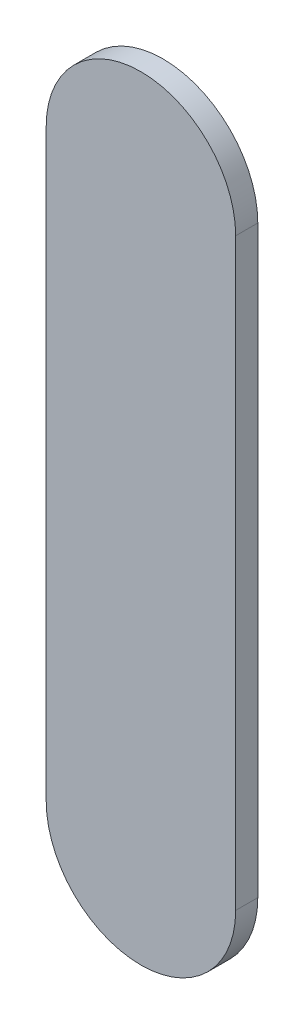
ISO-10303-21;
HEADER;
FILE_DESCRIPTION(('STEP AP214'),'2;1');
FILE_NAME('part.step','',(''),(''),'','','');
FILE_SCHEMA(('AUTOMOTIVE_DESIGN { 1 0 10303 214 1 1 1 1 }'));
ENDSEC;
DATA;
#1=APPLICATION_CONTEXT('core data for automotive mechanical design processes');
#2=APPLICATION_PROTOCOL_DEFINITION('international standard','automotive_design',2000,#1);
#3=PRODUCT_CONTEXT('',#1,'mechanical');
#4=PRODUCT('Part','Part','',(#3));
#5=PRODUCT_RELATED_PRODUCT_CATEGORY('part','',(#4));
#6=PRODUCT_DEFINITION_FORMATION('','',#4);
#7=PRODUCT_DEFINITION_CONTEXT('part definition',#1,'design');
#8=PRODUCT_DEFINITION('design','',#6,#7);
#9=PRODUCT_DEFINITION_SHAPE('','',#8);
#10=(LENGTH_UNIT() NAMED_UNIT(*) SI_UNIT(.MILLI.,.METRE.));
#11=(NAMED_UNIT(*) PLANE_ANGLE_UNIT() SI_UNIT($,.RADIAN.));
#12=(NAMED_UNIT(*) SI_UNIT($,.STERADIAN.) SOLID_ANGLE_UNIT());
#13=UNCERTAINTY_MEASURE_WITH_UNIT(LENGTH_MEASURE(1.E-05),#10,'distance_accuracy_value','');
#14=(GEOMETRIC_REPRESENTATION_CONTEXT(3) GLOBAL_UNCERTAINTY_ASSIGNED_CONTEXT((#13)) GLOBAL_UNIT_ASSIGNED_CONTEXT((#10,
#11,#12)) REPRESENTATION_CONTEXT('',''));
#15=CARTESIAN_POINT('',(0.,0.,0.));
#16=DIRECTION('',(0.,0.,1.));
#17=DIRECTION('',(1.,0.,0.));
#18=AXIS2_PLACEMENT_3D('',#15,#16,#17);
#19=CARTESIAN_POINT('',(134.,-56.5,1.635));
#20=DIRECTION('',(0.,0.,1.));
#21=DIRECTION('',(1.,0.,0.));
#22=AXIS2_PLACEMENT_3D('',#19,#20,#21);
#23=PLANE('',#22);
#24=DIRECTION('',(0.,1.,0.));
#25=VECTOR('',#24,1.);
#26=CARTESIAN_POINT('',(134.,-56.5,1.635));
#27=LINE('',#26,#25);
#28=CARTESIAN_POINT('',(134.,-56.5,1.635));
#29=VERTEX_POINT('',#28);
#30=CARTESIAN_POINT('',(134.,-55.575,1.635));
#31=VERTEX_POINT('',#30);
#32=EDGE_CURVE('E99',#29,#31,#27,.T.);
#33=ORIENTED_EDGE('',*,*,#32,.T.);
#34=CARTESIAN_POINT('',(133.85,-55.575,1.635));
#35=DIRECTION('',(0.,0.,1.));
#36=DIRECTION('',(1.,0.,0.));
#37=AXIS2_PLACEMENT_3D('',#34,#35,#36);
#38=CIRCLE('',#37,0.15);
#39=CARTESIAN_POINT('',(133.7,-55.575,1.635));
#40=VERTEX_POINT('',#39);
#41=EDGE_CURVE('E79',#31,#40,#38,.T.);
#42=ORIENTED_EDGE('',*,*,#41,.T.);
#43=DIRECTION('',(0.,-1.,0.));
#44=VECTOR('',#43,1.);
#45=CARTESIAN_POINT('',(133.7,-55.575,1.635));
#46=LINE('',#45,#44);
#47=CARTESIAN_POINT('',(133.7,-56.5,1.635));
#48=VERTEX_POINT('',#47);
#49=EDGE_CURVE('E20',#40,#48,#46,.T.);
#50=ORIENTED_EDGE('',*,*,#49,.T.);
#51=CARTESIAN_POINT('',(133.85,-56.5,1.635));
#52=DIRECTION('',(0.,0.,1.));
#53=DIRECTION('',(-1.,-1.42108547152E-13,0.));
#54=AXIS2_PLACEMENT_3D('',#51,#52,#53);
#55=CIRCLE('',#54,0.15);
#56=EDGE_CURVE('E11',#48,#29,#55,.T.);
#57=ORIENTED_EDGE('',*,*,#56,.T.);
#58=EDGE_LOOP('',(#33,#42,#50,#57));
#59=FACE_BOUND('',#58,.T.);
#60=ADVANCED_FACE('F17',(#59),#23,.T.);
#61=CARTESIAN_POINT('',(134.,-56.5,1.6));
#62=DIRECTION('',(0.,0.,1.));
#63=DIRECTION('',(1.,0.,0.));
#64=AXIS2_PLACEMENT_3D('',#61,#62,#63);
#65=PLANE('',#64);
#66=CARTESIAN_POINT('',(133.85,-56.5,1.6));
#67=DIRECTION('',(0.,0.,1.));
#68=DIRECTION('',(-1.,-1.42108547152E-13,0.));
#69=AXIS2_PLACEMENT_3D('',#66,#67,#68);
#70=CIRCLE('',#69,0.15);
#71=CARTESIAN_POINT('',(133.7,-56.5,1.6));
#72=VERTEX_POINT('',#71);
#73=CARTESIAN_POINT('',(134.,-56.5,1.6));
#74=VERTEX_POINT('',#73);
#75=EDGE_CURVE('E26',#72,#74,#70,.T.);
#76=ORIENTED_EDGE('',*,*,#75,.F.);
#77=DIRECTION('',(0.,-1.,0.));
#78=VECTOR('',#77,1.);
#79=CARTESIAN_POINT('',(133.7,-55.575,1.6));
#80=LINE('',#79,#78);
#81=CARTESIAN_POINT('',(133.7,-55.575,1.6));
#82=VERTEX_POINT('',#81);
#83=EDGE_CURVE('E69',#82,#72,#80,.T.);
#84=ORIENTED_EDGE('',*,*,#83,.F.);
#85=CARTESIAN_POINT('',(133.85,-55.575,1.6));
#86=DIRECTION('',(0.,0.,1.));
#87=DIRECTION('',(1.,0.,0.));
#88=AXIS2_PLACEMENT_3D('',#85,#86,#87);
#89=CIRCLE('',#88,0.15);
#90=CARTESIAN_POINT('',(134.,-55.575,1.6));
#91=VERTEX_POINT('',#90);
#92=EDGE_CURVE('E73',#91,#82,#89,.T.);
#93=ORIENTED_EDGE('',*,*,#92,.F.);
#94=DIRECTION('',(0.,1.,0.));
#95=VECTOR('',#94,1.);
#96=CARTESIAN_POINT('',(134.,-56.5,1.6));
#97=LINE('',#96,#95);
#98=EDGE_CURVE('E119',#74,#91,#97,.T.);
#99=ORIENTED_EDGE('',*,*,#98,.F.);
#100=EDGE_LOOP('',(#76,#84,#93,#99));
#101=FACE_BOUND('',#100,.T.);
#102=ADVANCED_FACE('F71',(#101),#65,.F.);
#103=CARTESIAN_POINT('',(133.85,-56.5,1.6));
#104=DIRECTION('',(0.,0.,-1.));
#105=DIRECTION('',(-1.,-1.42108547152E-13,0.));
#106=AXIS2_PLACEMENT_3D('',#103,#104,#105);
#107=CYLINDRICAL_SURFACE('',#106,0.15);
#108=ORIENTED_EDGE('',*,*,#75,.T.);
#109=DIRECTION('',(0.,0.,1.));
#110=VECTOR('',#109,1.);
#111=CARTESIAN_POINT('',(134.,-56.5,1.6));
#112=LINE('',#111,#110);
#113=EDGE_CURVE('E93',#74,#29,#112,.T.);
#114=ORIENTED_EDGE('',*,*,#113,.T.);
#115=ORIENTED_EDGE('',*,*,#56,.F.);
#116=DIRECTION('',(0.,0.,1.));
#117=VECTOR('',#116,1.);
#118=CARTESIAN_POINT('',(133.7,-56.5,1.6));
#119=LINE('',#118,#117);
#120=EDGE_CURVE('E78',#72,#48,#119,.T.);
#121=ORIENTED_EDGE('',*,*,#120,.F.);
#122=EDGE_LOOP('',(#108,#114,#115,#121));
#123=FACE_BOUND('',#122,.T.);
#124=ADVANCED_FACE('F115',(#123),#107,.T.);
#125=CARTESIAN_POINT('',(133.7,-55.575,1.6));
#126=DIRECTION('',(1.,0.,0.));
#127=DIRECTION('',(0.,1.,0.));
#128=AXIS2_PLACEMENT_3D('',#125,#126,#127);
#129=PLANE('',#128);
#130=ORIENTED_EDGE('',*,*,#83,.T.);
#131=ORIENTED_EDGE('',*,*,#120,.T.);
#132=ORIENTED_EDGE('',*,*,#49,.F.);
#133=DIRECTION('',(0.,0.,1.));
#134=VECTOR('',#133,1.);
#135=CARTESIAN_POINT('',(133.7,-55.575,1.6));
#136=LINE('',#135,#134);
#137=EDGE_CURVE('E82',#82,#40,#136,.T.);
#138=ORIENTED_EDGE('',*,*,#137,.F.);
#139=EDGE_LOOP('',(#130,#131,#132,#138));
#140=FACE_BOUND('',#139,.T.);
#141=ADVANCED_FACE('F83',(#140),#129,.F.);
#142=CARTESIAN_POINT('',(133.85,-55.575,1.6));
#143=DIRECTION('',(0.,0.,-1.));
#144=DIRECTION('',(1.,0.,0.));
#145=AXIS2_PLACEMENT_3D('',#142,#143,#144);
#146=CYLINDRICAL_SURFACE('',#145,0.15);
#147=ORIENTED_EDGE('',*,*,#92,.T.);
#148=ORIENTED_EDGE('',*,*,#137,.T.);
#149=ORIENTED_EDGE('',*,*,#41,.F.);
#150=DIRECTION('',(0.,0.,1.));
#151=VECTOR('',#150,1.);
#152=CARTESIAN_POINT('',(134.,-55.575,1.6));
#153=LINE('',#152,#151);
#154=EDGE_CURVE('E90',#91,#31,#153,.T.);
#155=ORIENTED_EDGE('',*,*,#154,.F.);
#156=EDGE_LOOP('',(#147,#148,#149,#155));
#157=FACE_BOUND('',#156,.T.);
#158=ADVANCED_FACE('F88',(#157),#146,.T.);
#159=CARTESIAN_POINT('',(134.,-56.5,1.6));
#160=DIRECTION('',(-1.,0.,0.));
#161=DIRECTION('',(0.,0.,1.));
#162=AXIS2_PLACEMENT_3D('',#159,#160,#161);
#163=PLANE('',#162);
#164=ORIENTED_EDGE('',*,*,#98,.T.);
#165=ORIENTED_EDGE('',*,*,#154,.T.);
#166=ORIENTED_EDGE('',*,*,#32,.F.);
#167=ORIENTED_EDGE('',*,*,#113,.F.);
#168=EDGE_LOOP('',(#164,#165,#166,#167));
#169=FACE_BOUND('',#168,.T.);
#170=ADVANCED_FACE('F118',(#169),#163,.F.);
#171=CLOSED_SHELL('',(#60,#102,#124,#141,#158,#170));
#172=MANIFOLD_SOLID_BREP('B1',#171);
#173=ADVANCED_BREP_SHAPE_REPRESENTATION('',(#18,#172),#14);
#174=SHAPE_DEFINITION_REPRESENTATION(#9,#173);
ENDSEC;
END-ISO-10303-21;
